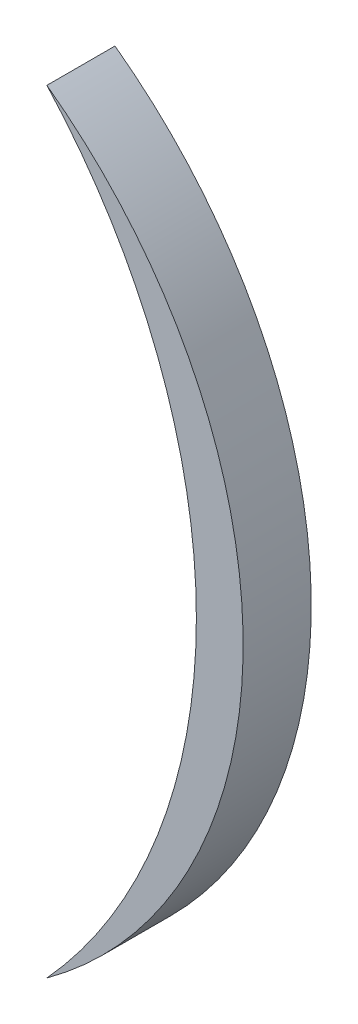
ISO-10303-21;
HEADER;
FILE_DESCRIPTION(('STEP AP214'),'2;1');
FILE_NAME('part.step','',(''),(''),'','','');
FILE_SCHEMA(('AUTOMOTIVE_DESIGN { 1 0 10303 214 1 1 1 1 }'));
ENDSEC;
DATA;
#1=APPLICATION_CONTEXT('core data for automotive mechanical design processes');
#2=APPLICATION_PROTOCOL_DEFINITION('international standard','automotive_design',2000,#1);
#3=PRODUCT_CONTEXT('',#1,'mechanical');
#4=PRODUCT('Part','Part','',(#3));
#5=PRODUCT_RELATED_PRODUCT_CATEGORY('part','',(#4));
#6=PRODUCT_DEFINITION_FORMATION('','',#4);
#7=PRODUCT_DEFINITION_CONTEXT('part definition',#1,'design');
#8=PRODUCT_DEFINITION('design','',#6,#7);
#9=PRODUCT_DEFINITION_SHAPE('','',#8);
#10=(LENGTH_UNIT() NAMED_UNIT(*) SI_UNIT(.MILLI.,.METRE.));
#11=(NAMED_UNIT(*) PLANE_ANGLE_UNIT() SI_UNIT($,.RADIAN.));
#12=(NAMED_UNIT(*) SI_UNIT($,.STERADIAN.) SOLID_ANGLE_UNIT());
#13=UNCERTAINTY_MEASURE_WITH_UNIT(LENGTH_MEASURE(1.E-05),#10,'distance_accuracy_value','');
#14=(GEOMETRIC_REPRESENTATION_CONTEXT(3) GLOBAL_UNCERTAINTY_ASSIGNED_CONTEXT((#13)) GLOBAL_UNIT_ASSIGNED_CONTEXT((#10,
#11,#12)) REPRESENTATION_CONTEXT('',''));
#15=CARTESIAN_POINT('',(0.,0.,0.));
#16=DIRECTION('',(0.,0.,1.));
#17=DIRECTION('',(1.,0.,0.));
#18=AXIS2_PLACEMENT_3D('',#15,#16,#17);
#19=CARTESIAN_POINT('',(101.47445034,112.50000106,0.));
#20=DIRECTION('',(0.,0.,-1.));
#21=DIRECTION('',(0.,-1.,0.));
#22=AXIS2_PLACEMENT_3D('',#19,#20,#21);
#23=CYLINDRICAL_SURFACE('',#22,0.249999500000001);
#24=CARTESIAN_POINT('',(101.47445034,112.50000106,0.03556));
#25=DIRECTION('',(0.,0.,1.));
#26=DIRECTION('',(0.,-1.,0.));
#27=AXIS2_PLACEMENT_3D('',#24,#25,#26);
#28=CIRCLE('',#27,0.249999500000001);
#29=CARTESIAN_POINT('',(101.621973071318,112.298167480671,0.03556));
#30=VERTEX_POINT('',#29);
#31=CARTESIAN_POINT('',(101.621973071318,112.701834639329,0.03556));
#32=VERTEX_POINT('',#31);
#33=EDGE_CURVE('E11',#30,#32,#28,.T.);
#34=ORIENTED_EDGE('',*,*,#33,.F.);
#35=DIRECTION('',(0.,0.,1.));
#36=VECTOR('',#35,1.);
#37=CARTESIAN_POINT('',(101.621973071318,112.298167480671,0.));
#38=LINE('',#37,#36);
#39=CARTESIAN_POINT('',(101.621973071318,112.298167480671,0.));
#40=VERTEX_POINT('',#39);
#41=EDGE_CURVE('E24',#40,#30,#38,.T.);
#42=ORIENTED_EDGE('',*,*,#41,.F.);
#43=CARTESIAN_POINT('',(101.47445034,112.50000106,0.));
#44=DIRECTION('',(0.,0.,1.));
#45=DIRECTION('',(0.,-1.,0.));
#46=AXIS2_PLACEMENT_3D('',#43,#44,#45);
#47=CIRCLE('',#46,0.249999500000001);
#48=CARTESIAN_POINT('',(101.621973071318,112.701834639329,0.));
#49=VERTEX_POINT('',#48);
#50=EDGE_CURVE('E66',#40,#49,#47,.T.);
#51=ORIENTED_EDGE('',*,*,#50,.T.);
#52=DIRECTION('',(0.,0.,1.));
#53=VECTOR('',#52,1.);
#54=CARTESIAN_POINT('',(101.621973071318,112.701834639329,0.));
#55=LINE('',#54,#53);
#56=EDGE_CURVE('E37',#49,#32,#55,.T.);
#57=ORIENTED_EDGE('',*,*,#56,.T.);
#58=EDGE_LOOP('',(#34,#42,#51,#57));
#59=FACE_BOUND('',#58,.T.);
#60=ADVANCED_FACE('F17',(#59),#23,.T.);
#61=CARTESIAN_POINT('',(101.40002072,112.50000106,0.));
#62=DIRECTION('',(0.,0.,-1.));
#63=DIRECTION('',(1.,0.,0.));
#64=AXIS2_PLACEMENT_3D('',#61,#62,#63);
#65=CYLINDRICAL_SURFACE('',#64,0.2999994);
#66=DIRECTION('',(0.,0.,1.));
#67=VECTOR('',#66,1.);
#68=CARTESIAN_POINT('',(101.70002012,112.50000106,0.));
#69=LINE('',#68,#67);
#70=CARTESIAN_POINT('',(101.70002012,112.50000106,0.));
#71=VERTEX_POINT('',#70);
#72=CARTESIAN_POINT('',(101.70002012,112.50000106,0.03556));
#73=VERTEX_POINT('',#72);
#74=EDGE_CURVE('E47',#71,#73,#69,.T.);
#75=ORIENTED_EDGE('',*,*,#74,.T.);
#76=CARTESIAN_POINT('',(101.40002072,112.50000106,0.03556));
#77=DIRECTION('',(0.,0.,1.));
#78=DIRECTION('',(1.,0.,0.));
#79=AXIS2_PLACEMENT_3D('',#76,#77,#78);
#80=CIRCLE('',#79,0.2999994);
#81=EDGE_CURVE('E57',#73,#32,#80,.T.);
#82=ORIENTED_EDGE('',*,*,#81,.T.);
#83=ORIENTED_EDGE('',*,*,#56,.F.);
#84=CARTESIAN_POINT('',(101.40002072,112.50000106,0.));
#85=DIRECTION('',(0.,0.,1.));
#86=DIRECTION('',(1.,0.,0.));
#87=AXIS2_PLACEMENT_3D('',#84,#85,#86);
#88=CIRCLE('',#87,0.2999994);
#89=EDGE_CURVE('E60',#71,#49,#88,.T.);
#90=ORIENTED_EDGE('',*,*,#89,.F.);
#91=EDGE_LOOP('',(#75,#82,#83,#90));
#92=FACE_BOUND('',#91,.T.);
#93=ADVANCED_FACE('F61',(#92),#65,.F.);
#94=CARTESIAN_POINT('',(101.40002072,112.50000106,0.));
#95=DIRECTION('',(0.,0.,-1.));
#96=DIRECTION('',(1.,0.,0.));
#97=AXIS2_PLACEMENT_3D('',#94,#95,#96);
#98=CYLINDRICAL_SURFACE('',#97,0.2999994);
#99=ORIENTED_EDGE('',*,*,#41,.T.);
#100=CARTESIAN_POINT('',(101.40002072,112.50000106,0.03556));
#101=DIRECTION('',(0.,0.,1.));
#102=DIRECTION('',(1.,0.,0.));
#103=AXIS2_PLACEMENT_3D('',#100,#101,#102);
#104=CIRCLE('',#103,0.2999994);
#105=EDGE_CURVE('E53',#30,#73,#104,.T.);
#106=ORIENTED_EDGE('',*,*,#105,.T.);
#107=ORIENTED_EDGE('',*,*,#74,.F.);
#108=EDGE_CURVE('E51',#40,#71,#88,.T.);
#109=ORIENTED_EDGE('',*,*,#108,.F.);
#110=EDGE_LOOP('',(#99,#106,#107,#109));
#111=FACE_BOUND('',#110,.T.);
#112=ADVANCED_FACE('F49',(#111),#98,.F.);
#113=CARTESIAN_POINT('',(101.40002072,112.25000156,0.));
#114=DIRECTION('',(0.,0.,-1.));
#115=DIRECTION('',(-1.,0.,0.));
#116=AXIS2_PLACEMENT_3D('',#113,#114,#115);
#117=PLANE('',#116);
#118=ORIENTED_EDGE('',*,*,#50,.F.);
#119=ORIENTED_EDGE('',*,*,#108,.T.);
#120=ORIENTED_EDGE('',*,*,#89,.T.);
#121=EDGE_LOOP('',(#118,#119,#120));
#122=FACE_BOUND('',#121,.T.);
#123=ADVANCED_FACE('F65',(#122),#117,.T.);
#124=CARTESIAN_POINT('',(101.40002072,112.25000156,0.03556));
#125=DIRECTION('',(0.,0.,-1.));
#126=DIRECTION('',(-1.,0.,0.));
#127=AXIS2_PLACEMENT_3D('',#124,#125,#126);
#128=PLANE('',#127);
#129=ORIENTED_EDGE('',*,*,#105,.F.);
#130=ORIENTED_EDGE('',*,*,#33,.T.);
#131=ORIENTED_EDGE('',*,*,#81,.F.);
#132=EDGE_LOOP('',(#129,#130,#131));
#133=FACE_BOUND('',#132,.T.);
#134=ADVANCED_FACE('F72',(#133),#128,.F.);
#135=CLOSED_SHELL('',(#60,#93,#112,#123,#134));
#136=MANIFOLD_SOLID_BREP('B1',#135);
#137=ADVANCED_BREP_SHAPE_REPRESENTATION('',(#18,#136),#14);
#138=SHAPE_DEFINITION_REPRESENTATION(#9,#137);
ENDSEC;
END-ISO-10303-21;
